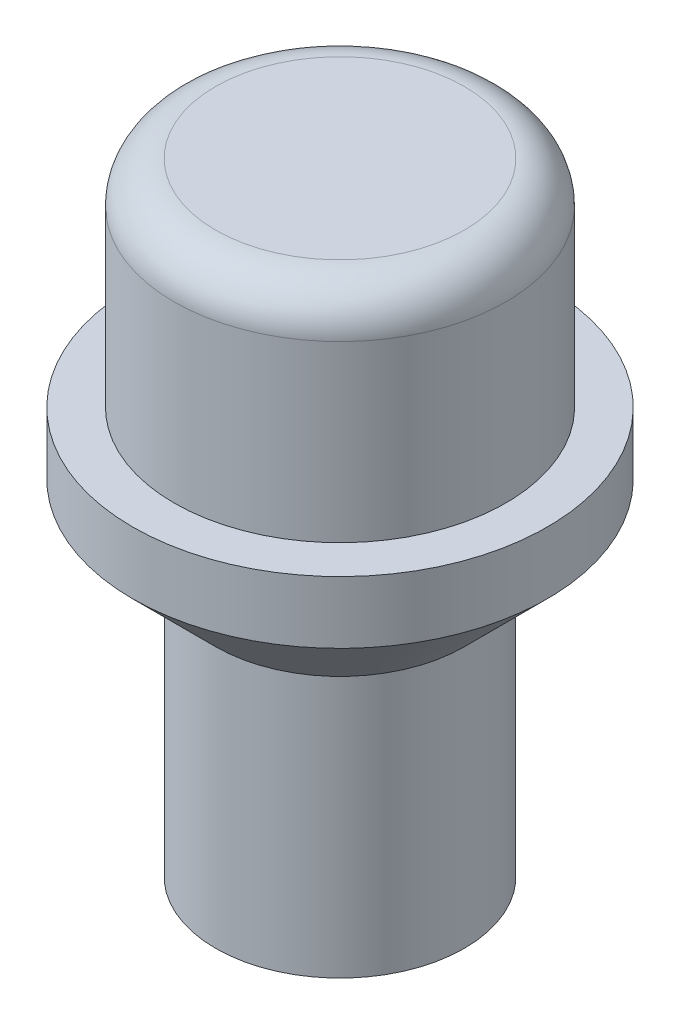
ISO-10303-21;
HEADER;
FILE_DESCRIPTION(('STEP AP214'),'2;1');
FILE_NAME('part.step','',(''),(''),'','','');
FILE_SCHEMA(('AUTOMOTIVE_DESIGN { 1 0 10303 214 1 1 1 1 }'));
ENDSEC;
DATA;
#1=APPLICATION_CONTEXT('core data for automotive mechanical design processes');
#2=APPLICATION_PROTOCOL_DEFINITION('international standard','automotive_design',2000,#1);
#3=PRODUCT_CONTEXT('',#1,'mechanical');
#4=PRODUCT('Part','Part','',(#3));
#5=PRODUCT_RELATED_PRODUCT_CATEGORY('part','',(#4));
#6=PRODUCT_DEFINITION_FORMATION('','',#4);
#7=PRODUCT_DEFINITION_CONTEXT('part definition',#1,'design');
#8=PRODUCT_DEFINITION('design','',#6,#7);
#9=PRODUCT_DEFINITION_SHAPE('','',#8);
#10=(LENGTH_UNIT() NAMED_UNIT(*) SI_UNIT(.MILLI.,.METRE.));
#11=(NAMED_UNIT(*) PLANE_ANGLE_UNIT() SI_UNIT($,.RADIAN.));
#12=(NAMED_UNIT(*) SI_UNIT($,.STERADIAN.) SOLID_ANGLE_UNIT());
#13=UNCERTAINTY_MEASURE_WITH_UNIT(LENGTH_MEASURE(1.E-05),#10,'distance_accuracy_value','');
#14=(GEOMETRIC_REPRESENTATION_CONTEXT(3) GLOBAL_UNCERTAINTY_ASSIGNED_CONTEXT((#13)) GLOBAL_UNIT_ASSIGNED_CONTEXT((#10,
#11,#12)) REPRESENTATION_CONTEXT('',''));
#15=CARTESIAN_POINT('',(0.,0.,0.));
#16=DIRECTION('',(0.,0.,1.));
#17=DIRECTION('',(1.,0.,0.));
#18=AXIS2_PLACEMENT_3D('',#15,#16,#17);
#19=CARTESIAN_POINT('',(0.,0.,0.));
#20=DIRECTION('',(0.,1.,0.));
#21=DIRECTION('',(0.,0.,1.));
#22=AXIS2_PLACEMENT_3D('',#19,#20,#21);
#23=PLANE('',#22);
#24=CARTESIAN_POINT('',(0.,0.,0.));
#25=DIRECTION('',(0.,1.,0.));
#26=DIRECTION('',(0.,0.,1.));
#27=AXIS2_PLACEMENT_3D('',#24,#25,#26);
#28=CIRCLE('',#27,3.);
#29=CARTESIAN_POINT('',(0.,0.,3.));
#30=VERTEX_POINT('',#29);
#31=EDGE_CURVE('E44',#30,#30,#28,.T.);
#32=ORIENTED_EDGE('',*,*,#31,.F.);
#33=EDGE_LOOP('',(#32));
#34=FACE_BOUND('',#33,.T.);
#35=ADVANCED_FACE('F33',(#34),#23,.F.);
#36=CARTESIAN_POINT('',(0.,8.65546218487396,0.));
#37=DIRECTION('',(0.,1.,0.));
#38=DIRECTION('',(0.,0.,1.));
#39=AXIS2_PLACEMENT_3D('',#36,#37,#38);
#40=CYLINDRICAL_SURFACE('',#39,3.);
#41=CARTESIAN_POINT('',(0.,6.30000000000001,0.));
#42=DIRECTION('',(0.,1.,0.));
#43=DIRECTION('',(0.,0.,1.));
#44=AXIS2_PLACEMENT_3D('',#41,#42,#43);
#45=CIRCLE('',#44,3.);
#46=CARTESIAN_POINT('',(0.,6.30000000000001,3.));
#47=VERTEX_POINT('',#46);
#48=EDGE_CURVE('E48',#47,#47,#45,.T.);
#49=ORIENTED_EDGE('',*,*,#48,.F.);
#50=EDGE_LOOP('',(#49));
#51=FACE_BOUND('',#50,.T.);
#52=ORIENTED_EDGE('',*,*,#31,.T.);
#53=EDGE_LOOP('',(#52));
#54=FACE_BOUND('',#53,.T.);
#55=ADVANCED_FACE('F80',(#51,#54),#40,.T.);
#56=CARTESIAN_POINT('',(0.,6.30000000000001,0.));
#57=DIRECTION('',(0.,1.,0.));
#58=DIRECTION('',(0.,0.,1.));
#59=AXIS2_PLACEMENT_3D('',#56,#57,#58);
#60=CONICAL_SURFACE('',#59,3.,0.78539816339745);
#61=CARTESIAN_POINT('',(0.,8.3,0.));
#62=DIRECTION('',(0.,1.,0.));
#63=DIRECTION('',(0.,0.,1.));
#64=AXIS2_PLACEMENT_3D('',#61,#62,#63);
#65=CIRCLE('',#64,5.);
#66=CARTESIAN_POINT('',(0.,8.3,5.));
#67=VERTEX_POINT('',#66);
#68=EDGE_CURVE('E53',#67,#67,#65,.T.);
#69=ORIENTED_EDGE('',*,*,#68,.F.);
#70=EDGE_LOOP('',(#69));
#71=FACE_BOUND('',#70,.T.);
#72=ORIENTED_EDGE('',*,*,#48,.T.);
#73=EDGE_LOOP('',(#72));
#74=FACE_BOUND('',#73,.T.);
#75=ADVANCED_FACE('F74',(#71,#74),#60,.T.);
#76=CARTESIAN_POINT('',(0.,8.65546218487396,0.));
#77=DIRECTION('',(0.,1.,0.));
#78=DIRECTION('',(0.,0.,1.));
#79=AXIS2_PLACEMENT_3D('',#76,#77,#78);
#80=CYLINDRICAL_SURFACE('',#79,5.);
#81=CARTESIAN_POINT('',(0.,9.8,0.));
#82=DIRECTION('',(0.,1.,0.));
#83=DIRECTION('',(0.,0.,1.));
#84=AXIS2_PLACEMENT_3D('',#81,#82,#83);
#85=CIRCLE('',#84,5.);
#86=CARTESIAN_POINT('',(0.,9.8,5.));
#87=VERTEX_POINT('',#86);
#88=EDGE_CURVE('E56',#87,#87,#85,.T.);
#89=ORIENTED_EDGE('',*,*,#88,.F.);
#90=EDGE_LOOP('',(#89));
#91=FACE_BOUND('',#90,.T.);
#92=ORIENTED_EDGE('',*,*,#68,.T.);
#93=EDGE_LOOP('',(#92));
#94=FACE_BOUND('',#93,.T.);
#95=ADVANCED_FACE('F68',(#91,#94),#80,.T.);
#96=CARTESIAN_POINT('',(0.,9.8,-5.));
#97=DIRECTION('',(0.,-1.,0.));
#98=DIRECTION('',(0.,0.,-1.));
#99=AXIS2_PLACEMENT_3D('',#96,#97,#98);
#100=PLANE('',#99);
#101=CARTESIAN_POINT('',(0.,9.8,0.));
#102=DIRECTION('',(0.,1.,0.));
#103=DIRECTION('',(0.,0.,1.));
#104=AXIS2_PLACEMENT_3D('',#101,#102,#103);
#105=CIRCLE('',#104,4.);
#106=CARTESIAN_POINT('',(0.,9.8,4.));
#107=VERTEX_POINT('',#106);
#108=EDGE_CURVE('E59',#107,#107,#105,.T.);
#109=ORIENTED_EDGE('',*,*,#108,.F.);
#110=EDGE_LOOP('',(#109));
#111=FACE_BOUND('',#110,.T.);
#112=ORIENTED_EDGE('',*,*,#88,.T.);
#113=EDGE_LOOP('',(#112));
#114=FACE_BOUND('',#113,.T.);
#115=ADVANCED_FACE('F65',(#111,#114),#100,.F.);
#116=CARTESIAN_POINT('',(0.,8.65546218487396,0.));
#117=DIRECTION('',(0.,1.,0.));
#118=DIRECTION('',(0.,0.,1.));
#119=AXIS2_PLACEMENT_3D('',#116,#117,#118);
#120=CYLINDRICAL_SURFACE('',#119,4.);
#121=CARTESIAN_POINT('',(0.,14.,0.));
#122=DIRECTION('',(0.,-1.,0.));
#123=DIRECTION('',(0.,0.,-1.));
#124=AXIS2_PLACEMENT_3D('',#121,#122,#123);
#125=CIRCLE('',#124,4.);
#126=CARTESIAN_POINT('',(0.,14.,-4.));
#127=VERTEX_POINT('',#126);
#128=EDGE_CURVE('E10',#127,#127,#125,.T.);
#129=ORIENTED_EDGE('',*,*,#128,.T.);
#130=EDGE_LOOP('',(#129));
#131=FACE_BOUND('',#130,.T.);
#132=ORIENTED_EDGE('',*,*,#108,.T.);
#133=EDGE_LOOP('',(#132));
#134=FACE_BOUND('',#133,.T.);
#135=ADVANCED_FACE('F63',(#131,#134),#120,.T.);
#136=CARTESIAN_POINT('',(0.,15.,-4.));
#137=DIRECTION('',(0.,-1.,0.));
#138=DIRECTION('',(0.,0.,-1.));
#139=AXIS2_PLACEMENT_3D('',#136,#137,#138);
#140=PLANE('',#139);
#141=CARTESIAN_POINT('',(0.,15.,0.));
#142=DIRECTION('',(0.,-1.,0.));
#143=DIRECTION('',(0.,0.,-1.));
#144=AXIS2_PLACEMENT_3D('',#141,#142,#143);
#145=CIRCLE('',#144,3.);
#146=CARTESIAN_POINT('',(0.,15.,-3.));
#147=VERTEX_POINT('',#146);
#148=EDGE_CURVE('E40',#147,#147,#145,.F.);
#149=ORIENTED_EDGE('',*,*,#148,.T.);
#150=EDGE_LOOP('',(#149));
#151=FACE_BOUND('',#150,.T.);
#152=ADVANCED_FACE('F95',(#151),#140,.F.);
#153=CARTESIAN_POINT('',(0.,14.,0.));
#154=DIRECTION('',(0.,-1.,0.));
#155=DIRECTION('',(0.,0.,-1.));
#156=AXIS2_PLACEMENT_3D('',#153,#154,#155);
#157=TOROIDAL_SURFACE('',#156,3.,1.);
#158=ORIENTED_EDGE('',*,*,#128,.F.);
#159=EDGE_LOOP('',(#158));
#160=FACE_BOUND('',#159,.T.);
#161=ORIENTED_EDGE('',*,*,#148,.F.);
#162=EDGE_LOOP('',(#161));
#163=FACE_BOUND('',#162,.T.);
#164=ADVANCED_FACE('F35',(#160,#163),#157,.T.);
#165=CLOSED_SHELL('',(#35,#55,#75,#95,#115,#135,#152,#164));
#166=MANIFOLD_SOLID_BREP('B2',#165);
#167=ADVANCED_BREP_SHAPE_REPRESENTATION('',(#18,#166),#14);
#168=SHAPE_DEFINITION_REPRESENTATION(#9,#167);
ENDSEC;
END-ISO-10303-21;
